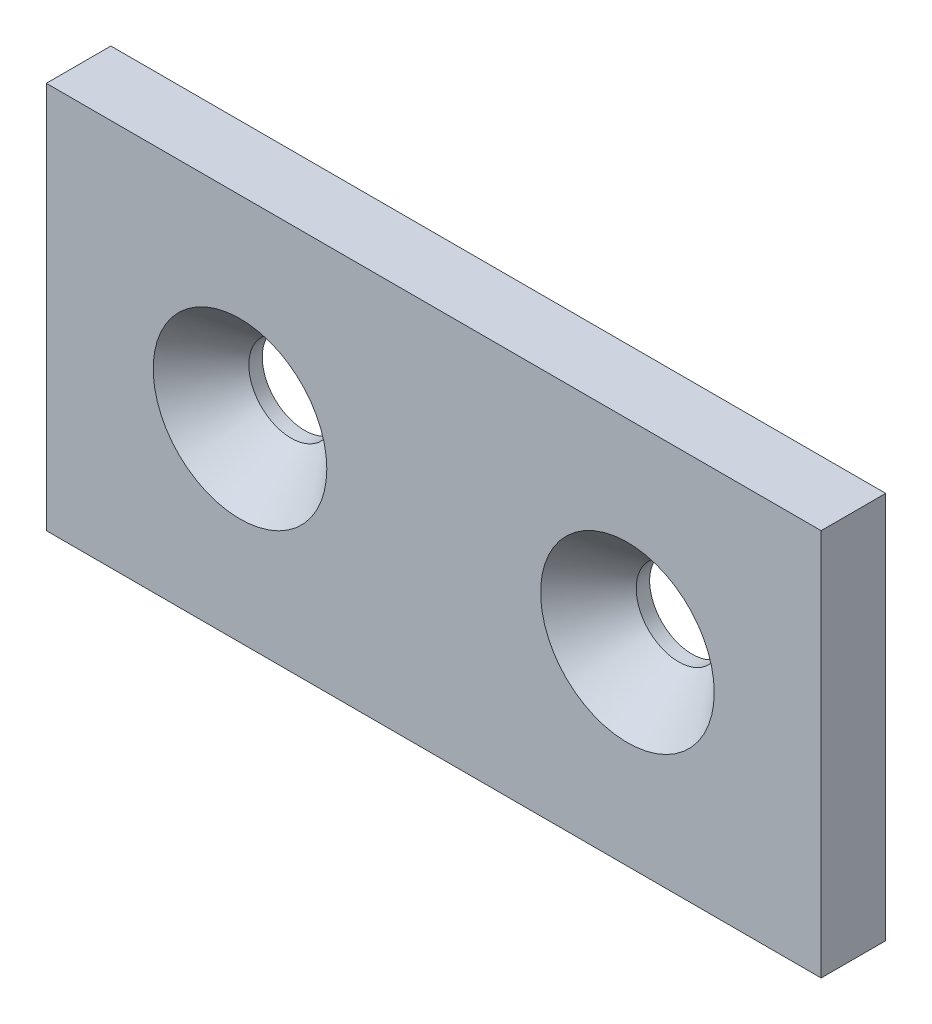
ISO-10303-21;
HEADER;
FILE_DESCRIPTION(('STEP AP214'),'2;1');
FILE_NAME('part.step','',(''),(''),'','','');
FILE_SCHEMA(('AUTOMOTIVE_DESIGN { 1 0 10303 214 1 1 1 1 }'));
ENDSEC;
DATA;
#1=APPLICATION_CONTEXT('core data for automotive mechanical design processes');
#2=APPLICATION_PROTOCOL_DEFINITION('international standard','automotive_design',2000,#1);
#3=PRODUCT_CONTEXT('',#1,'mechanical');
#4=PRODUCT('Part','Part','',(#3));
#5=PRODUCT_RELATED_PRODUCT_CATEGORY('part','',(#4));
#6=PRODUCT_DEFINITION_FORMATION('','',#4);
#7=PRODUCT_DEFINITION_CONTEXT('part definition',#1,'design');
#8=PRODUCT_DEFINITION('design','',#6,#7);
#9=PRODUCT_DEFINITION_SHAPE('','',#8);
#10=(LENGTH_UNIT() NAMED_UNIT(*) SI_UNIT(.MILLI.,.METRE.));
#11=(NAMED_UNIT(*) PLANE_ANGLE_UNIT() SI_UNIT($,.RADIAN.));
#12=(NAMED_UNIT(*) SI_UNIT($,.STERADIAN.) SOLID_ANGLE_UNIT());
#13=UNCERTAINTY_MEASURE_WITH_UNIT(LENGTH_MEASURE(1.E-05),#10,'distance_accuracy_value','');
#14=(GEOMETRIC_REPRESENTATION_CONTEXT(3) GLOBAL_UNCERTAINTY_ASSIGNED_CONTEXT((#13)) GLOBAL_UNIT_ASSIGNED_CONTEXT((#10,
#11,#12)) REPRESENTATION_CONTEXT('',''));
#15=CARTESIAN_POINT('',(0.,0.,0.));
#16=DIRECTION('',(0.,0.,1.));
#17=DIRECTION('',(1.,0.,0.));
#18=AXIS2_PLACEMENT_3D('',#15,#16,#17);
#19=CARTESIAN_POINT('',(0.,0.,3.175));
#20=DIRECTION('',(0.,0.,-1.));
#21=DIRECTION('',(-1.,0.,0.));
#22=AXIS2_PLACEMENT_3D('',#19,#20,#21);
#23=PLANE('',#22);
#24=CARTESIAN_POINT('',(19.05,19.05,3.175));
#25=DIRECTION('',(0.,0.,1.));
#26=DIRECTION('',(1.,0.,0.));
#27=AXIS2_PLACEMENT_3D('',#24,#25,#26);
#28=CIRCLE('',#27,8.53741686182538);
#29=CARTESIAN_POINT('',(27.5874168618254,19.05,3.175));
#30=VERTEX_POINT('',#29);
#31=EDGE_CURVE('E196',#30,#30,#28,.T.);
#32=ORIENTED_EDGE('',*,*,#31,.F.);
#33=EDGE_LOOP('',(#32));
#34=FACE_BOUND('',#33,.T.);
#35=DIRECTION('',(1.,0.,0.));
#36=VECTOR('',#35,1.);
#37=CARTESIAN_POINT('',(76.2,0.,3.175));
#38=LINE('',#37,#36);
#39=CARTESIAN_POINT('',(0.,0.,3.175));
#40=VERTEX_POINT('',#39);
#41=CARTESIAN_POINT('',(76.2,0.,3.175));
#42=VERTEX_POINT('',#41);
#43=EDGE_CURVE('E164',#40,#42,#38,.T.);
#44=ORIENTED_EDGE('',*,*,#43,.T.);
#45=DIRECTION('',(0.,1.,0.));
#46=VECTOR('',#45,1.);
#47=CARTESIAN_POINT('',(76.2,38.1,3.175));
#48=LINE('',#47,#46);
#49=CARTESIAN_POINT('',(76.2,38.1,3.175));
#50=VERTEX_POINT('',#49);
#51=EDGE_CURVE('E159',#42,#50,#48,.T.);
#52=ORIENTED_EDGE('',*,*,#51,.T.);
#53=DIRECTION('',(-1.,0.,0.));
#54=VECTOR('',#53,1.);
#55=CARTESIAN_POINT('',(76.2,38.1,3.175));
#56=LINE('',#55,#54);
#57=CARTESIAN_POINT('',(0.,38.1,3.175));
#58=VERTEX_POINT('',#57);
#59=EDGE_CURVE('E162',#50,#58,#56,.T.);
#60=ORIENTED_EDGE('',*,*,#59,.T.);
#61=DIRECTION('',(0.,-1.,0.));
#62=VECTOR('',#61,1.);
#63=CARTESIAN_POINT('',(0.,0.,3.175));
#64=LINE('',#63,#62);
#65=EDGE_CURVE('E129',#58,#40,#64,.T.);
#66=ORIENTED_EDGE('',*,*,#65,.T.);
#67=EDGE_LOOP('',(#44,#52,#60,#66));
#68=FACE_BOUND('',#67,.T.);
#69=CARTESIAN_POINT('',(57.15,19.05,3.175));
#70=DIRECTION('',(0.,0.,1.));
#71=DIRECTION('',(1.,0.,0.));
#72=AXIS2_PLACEMENT_3D('',#69,#70,#71);
#73=CIRCLE('',#72,8.53741686182538);
#74=CARTESIAN_POINT('',(65.6874168618254,19.05,3.175));
#75=VERTEX_POINT('',#74);
#76=EDGE_CURVE('E202',#75,#75,#73,.T.);
#77=ORIENTED_EDGE('',*,*,#76,.F.);
#78=EDGE_LOOP('',(#77));
#79=FACE_BOUND('',#78,.T.);
#80=ADVANCED_FACE('F112',(#34,#68,#79),#23,.F.);
#81=CARTESIAN_POINT('',(57.15,19.05,3.175));
#82=DIRECTION('',(0.,0.,-1.));
#83=DIRECTION('',(-1.,0.,0.));
#84=AXIS2_PLACEMENT_3D('',#81,#82,#83);
#85=CYLINDRICAL_SURFACE('',#84,4.1656);
#86=CARTESIAN_POINT('',(57.15,19.05,-3.175));
#87=DIRECTION('',(0.,0.,1.));
#88=DIRECTION('',(1.,0.,0.));
#89=AXIS2_PLACEMENT_3D('',#86,#87,#88);
#90=CIRCLE('',#89,4.1656);
#91=CARTESIAN_POINT('',(61.3156,19.05,-3.175));
#92=VERTEX_POINT('',#91);
#93=EDGE_CURVE('E193',#92,#92,#90,.T.);
#94=ORIENTED_EDGE('',*,*,#93,.F.);
#95=EDGE_LOOP('',(#94));
#96=FACE_BOUND('',#95,.T.);
#97=CARTESIAN_POINT('',(57.15,19.05,-1.8542));
#98=DIRECTION('',(0.,0.,1.));
#99=DIRECTION('',(1.,0.,0.));
#100=AXIS2_PLACEMENT_3D('',#97,#98,#99);
#101=CIRCLE('',#100,4.1656);
#102=CARTESIAN_POINT('',(61.3156,19.05,-1.8542));
#103=VERTEX_POINT('',#102);
#104=EDGE_CURVE('E205',#103,#103,#101,.T.);
#105=ORIENTED_EDGE('',*,*,#104,.T.);
#106=EDGE_LOOP('',(#105));
#107=FACE_BOUND('',#106,.T.);
#108=ADVANCED_FACE('F209',(#96,#107),#85,.F.);
#109=CARTESIAN_POINT('',(19.05,19.05,3.175));
#110=DIRECTION('',(0.,0.,-1.));
#111=DIRECTION('',(-1.,0.,0.));
#112=AXIS2_PLACEMENT_3D('',#109,#110,#111);
#113=CYLINDRICAL_SURFACE('',#112,4.1656);
#114=CARTESIAN_POINT('',(19.05,19.05,-3.175));
#115=DIRECTION('',(0.,0.,1.));
#116=DIRECTION('',(1.,0.,0.));
#117=AXIS2_PLACEMENT_3D('',#114,#115,#116);
#118=CIRCLE('',#117,4.1656);
#119=CARTESIAN_POINT('',(23.2156,19.05,-3.175));
#120=VERTEX_POINT('',#119);
#121=EDGE_CURVE('E179',#120,#120,#118,.T.);
#122=ORIENTED_EDGE('',*,*,#121,.F.);
#123=EDGE_LOOP('',(#122));
#124=FACE_BOUND('',#123,.T.);
#125=CARTESIAN_POINT('',(19.05,19.05,-1.8542));
#126=DIRECTION('',(0.,0.,1.));
#127=DIRECTION('',(1.,0.,0.));
#128=AXIS2_PLACEMENT_3D('',#125,#126,#127);
#129=CIRCLE('',#128,4.1656);
#130=CARTESIAN_POINT('',(23.2156,19.05,-1.8542));
#131=VERTEX_POINT('',#130);
#132=EDGE_CURVE('E199',#131,#131,#129,.T.);
#133=ORIENTED_EDGE('',*,*,#132,.T.);
#134=EDGE_LOOP('',(#133));
#135=FACE_BOUND('',#134,.T.);
#136=ADVANCED_FACE('F227',(#124,#135),#113,.F.);
#137=CARTESIAN_POINT('',(0.,0.,-3.175));
#138=DIRECTION('',(0.,0.,-1.));
#139=DIRECTION('',(-1.,0.,0.));
#140=AXIS2_PLACEMENT_3D('',#137,#138,#139);
#141=PLANE('',#140);
#142=ORIENTED_EDGE('',*,*,#121,.T.);
#143=EDGE_LOOP('',(#142));
#144=FACE_BOUND('',#143,.T.);
#145=DIRECTION('',(1.,0.,0.));
#146=VECTOR('',#145,1.);
#147=CARTESIAN_POINT('',(76.2,0.,-3.175));
#148=LINE('',#147,#146);
#149=CARTESIAN_POINT('',(0.,0.,-3.175));
#150=VERTEX_POINT('',#149);
#151=CARTESIAN_POINT('',(76.2,0.,-3.175));
#152=VERTEX_POINT('',#151);
#153=EDGE_CURVE('E176',#150,#152,#148,.T.);
#154=ORIENTED_EDGE('',*,*,#153,.F.);
#155=DIRECTION('',(0.,-1.,0.));
#156=VECTOR('',#155,1.);
#157=CARTESIAN_POINT('',(0.,0.,-3.175));
#158=LINE('',#157,#156);
#159=CARTESIAN_POINT('',(0.,38.1,-3.175));
#160=VERTEX_POINT('',#159);
#161=EDGE_CURVE('E152',#160,#150,#158,.T.);
#162=ORIENTED_EDGE('',*,*,#161,.F.);
#163=DIRECTION('',(-1.,0.,0.));
#164=VECTOR('',#163,1.);
#165=CARTESIAN_POINT('',(76.2,38.1,-3.175));
#166=LINE('',#165,#164);
#167=CARTESIAN_POINT('',(76.2,38.1,-3.175));
#168=VERTEX_POINT('',#167);
#169=EDGE_CURVE('E146',#168,#160,#166,.T.);
#170=ORIENTED_EDGE('',*,*,#169,.F.);
#171=DIRECTION('',(0.,1.,0.));
#172=VECTOR('',#171,1.);
#173=CARTESIAN_POINT('',(76.2,38.1,-3.175));
#174=LINE('',#173,#172);
#175=EDGE_CURVE('E168',#152,#168,#174,.T.);
#176=ORIENTED_EDGE('',*,*,#175,.F.);
#177=EDGE_LOOP('',(#154,#162,#170,#176));
#178=FACE_BOUND('',#177,.T.);
#179=ORIENTED_EDGE('',*,*,#93,.T.);
#180=EDGE_LOOP('',(#179));
#181=FACE_BOUND('',#180,.T.);
#182=ADVANCED_FACE('F187',(#144,#178,#181),#141,.T.);
#183=CARTESIAN_POINT('',(76.2,0.,3.175));
#184=DIRECTION('',(0.,1.,0.));
#185=DIRECTION('',(-1.,0.,0.));
#186=AXIS2_PLACEMENT_3D('',#183,#184,#185);
#187=PLANE('',#186);
#188=ORIENTED_EDGE('',*,*,#153,.T.);
#189=DIRECTION('',(0.,0.,-1.));
#190=VECTOR('',#189,1.);
#191=CARTESIAN_POINT('',(76.2,0.,3.175));
#192=LINE('',#191,#190);
#193=EDGE_CURVE('E12',#42,#152,#192,.T.);
#194=ORIENTED_EDGE('',*,*,#193,.F.);
#195=ORIENTED_EDGE('',*,*,#43,.F.);
#196=DIRECTION('',(0.,0.,-1.));
#197=VECTOR('',#196,1.);
#198=CARTESIAN_POINT('',(0.,0.,3.175));
#199=LINE('',#198,#197);
#200=EDGE_CURVE('E172',#40,#150,#199,.T.);
#201=ORIENTED_EDGE('',*,*,#200,.T.);
#202=EDGE_LOOP('',(#188,#194,#195,#201));
#203=FACE_BOUND('',#202,.T.);
#204=ADVANCED_FACE('F114',(#203),#187,.F.);
#205=CARTESIAN_POINT('',(76.2,38.1,3.175));
#206=DIRECTION('',(-1.,0.,0.));
#207=DIRECTION('',(0.,0.,1.));
#208=AXIS2_PLACEMENT_3D('',#205,#206,#207);
#209=PLANE('',#208);
#210=ORIENTED_EDGE('',*,*,#175,.T.);
#211=DIRECTION('',(0.,0.,-1.));
#212=VECTOR('',#211,1.);
#213=CARTESIAN_POINT('',(76.2,38.1,3.175));
#214=LINE('',#213,#212);
#215=EDGE_CURVE('E121',#50,#168,#214,.T.);
#216=ORIENTED_EDGE('',*,*,#215,.F.);
#217=ORIENTED_EDGE('',*,*,#51,.F.);
#218=ORIENTED_EDGE('',*,*,#193,.T.);
#219=EDGE_LOOP('',(#210,#216,#217,#218));
#220=FACE_BOUND('',#219,.T.);
#221=ADVANCED_FACE('F167',(#220),#209,.F.);
#222=CARTESIAN_POINT('',(76.2,38.1,3.175));
#223=DIRECTION('',(0.,-1.,0.));
#224=DIRECTION('',(1.,0.,0.));
#225=AXIS2_PLACEMENT_3D('',#222,#223,#224);
#226=PLANE('',#225);
#227=ORIENTED_EDGE('',*,*,#169,.T.);
#228=DIRECTION('',(0.,0.,-1.));
#229=VECTOR('',#228,1.);
#230=CARTESIAN_POINT('',(0.,38.1,3.175));
#231=LINE('',#230,#229);
#232=EDGE_CURVE('E169',#58,#160,#231,.T.);
#233=ORIENTED_EDGE('',*,*,#232,.F.);
#234=ORIENTED_EDGE('',*,*,#59,.F.);
#235=ORIENTED_EDGE('',*,*,#215,.T.);
#236=EDGE_LOOP('',(#227,#233,#234,#235));
#237=FACE_BOUND('',#236,.T.);
#238=ADVANCED_FACE('F170',(#237),#226,.F.);
#239=CARTESIAN_POINT('',(0.,0.,3.175));
#240=DIRECTION('',(1.,0.,0.));
#241=DIRECTION('',(0.,0.,-1.));
#242=AXIS2_PLACEMENT_3D('',#239,#240,#241);
#243=PLANE('',#242);
#244=ORIENTED_EDGE('',*,*,#161,.T.);
#245=ORIENTED_EDGE('',*,*,#200,.F.);
#246=ORIENTED_EDGE('',*,*,#65,.F.);
#247=ORIENTED_EDGE('',*,*,#232,.T.);
#248=EDGE_LOOP('',(#244,#245,#246,#247));
#249=FACE_BOUND('',#248,.T.);
#250=ADVANCED_FACE('F184',(#249),#243,.F.);
#251=CARTESIAN_POINT('',(19.05,19.05,-1.8542));
#252=DIRECTION('',(0.,0.,1.));
#253=DIRECTION('',(1.,0.,0.));
#254=AXIS2_PLACEMENT_3D('',#251,#252,#253);
#255=CONICAL_SURFACE('',#254,4.1656,0.715584993317677);
#256=ORIENTED_EDGE('',*,*,#31,.T.);
#257=EDGE_LOOP('',(#256));
#258=FACE_BOUND('',#257,.T.);
#259=ORIENTED_EDGE('',*,*,#132,.F.);
#260=EDGE_LOOP('',(#259));
#261=FACE_BOUND('',#260,.T.);
#262=ADVANCED_FACE('F213',(#258,#261),#255,.F.);
#263=CARTESIAN_POINT('',(57.15,19.05,-1.8542));
#264=DIRECTION('',(0.,0.,1.));
#265=DIRECTION('',(1.,0.,0.));
#266=AXIS2_PLACEMENT_3D('',#263,#264,#265);
#267=CONICAL_SURFACE('',#266,4.1656,0.715584993317677);
#268=ORIENTED_EDGE('',*,*,#76,.T.);
#269=EDGE_LOOP('',(#268));
#270=FACE_BOUND('',#269,.T.);
#271=ORIENTED_EDGE('',*,*,#104,.F.);
#272=EDGE_LOOP('',(#271));
#273=FACE_BOUND('',#272,.T.);
#274=ADVANCED_FACE('F211',(#270,#273),#267,.F.);
#275=CLOSED_SHELL('',(#80,#108,#136,#182,#204,#221,#238,#250,#262,#274));
#276=MANIFOLD_SOLID_BREP('B2',#275);
#277=ADVANCED_BREP_SHAPE_REPRESENTATION('',(#18,#276),#14);
#278=SHAPE_DEFINITION_REPRESENTATION(#9,#277);
ENDSEC;
END-ISO-10303-21;
